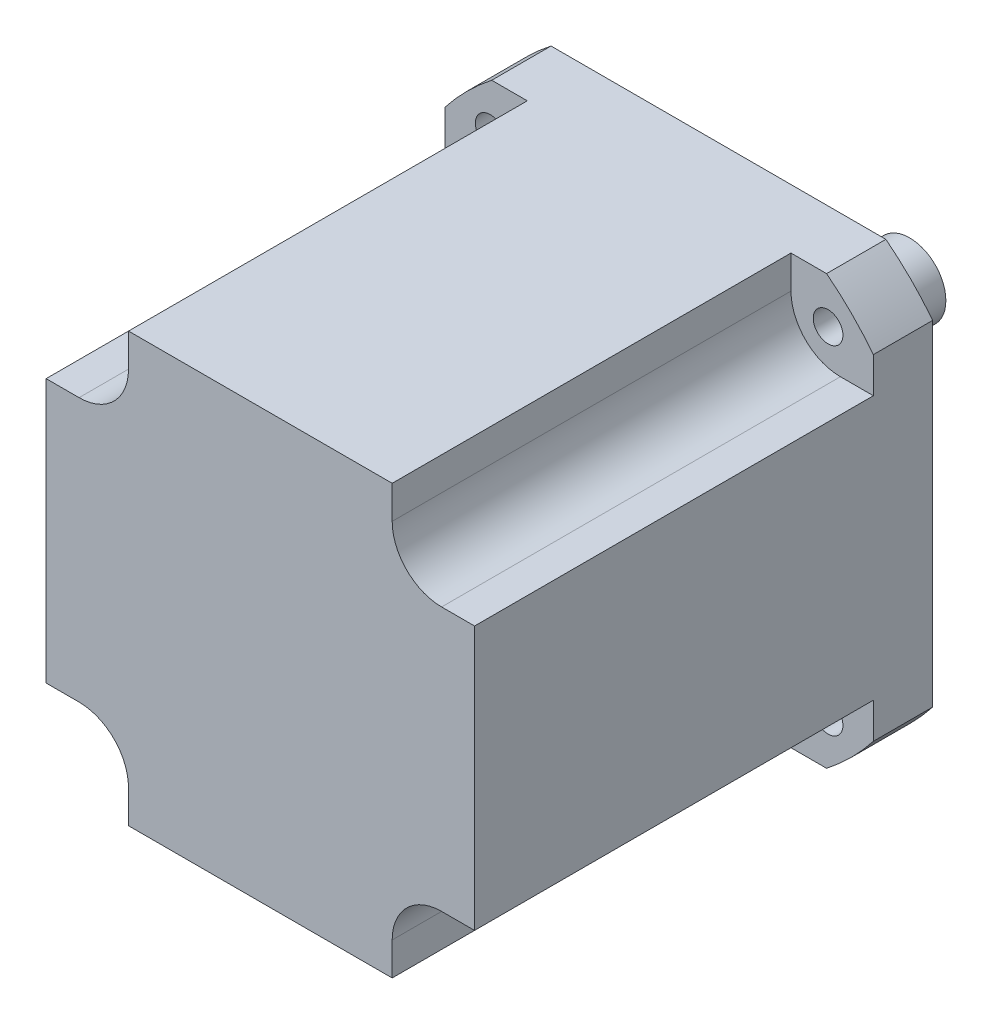
ISO-10303-21;
HEADER;
FILE_DESCRIPTION(('STEP AP214'),'2;1');
FILE_NAME('part.step','',(''),(''),'','','');
FILE_SCHEMA(('AUTOMOTIVE_DESIGN { 1 0 10303 214 1 1 1 1 }'));
ENDSEC;
DATA;
#1=APPLICATION_CONTEXT('core data for automotive mechanical design processes');
#2=APPLICATION_PROTOCOL_DEFINITION('international standard','automotive_design',2000,#1);
#3=PRODUCT_CONTEXT('',#1,'mechanical');
#4=PRODUCT('Part','Part','',(#3));
#5=PRODUCT_RELATED_PRODUCT_CATEGORY('part','',(#4));
#6=PRODUCT_DEFINITION_FORMATION('','',#4);
#7=PRODUCT_DEFINITION_CONTEXT('part definition',#1,'design');
#8=PRODUCT_DEFINITION('design','',#6,#7);
#9=PRODUCT_DEFINITION_SHAPE('','',#8);
#10=(LENGTH_UNIT() NAMED_UNIT(*) SI_UNIT(.MILLI.,.METRE.));
#11=(NAMED_UNIT(*) PLANE_ANGLE_UNIT() SI_UNIT($,.RADIAN.));
#12=(NAMED_UNIT(*) SI_UNIT($,.STERADIAN.) SOLID_ANGLE_UNIT());
#13=UNCERTAINTY_MEASURE_WITH_UNIT(LENGTH_MEASURE(1.E-05),#10,'distance_accuracy_value','');
#14=(GEOMETRIC_REPRESENTATION_CONTEXT(3) GLOBAL_UNCERTAINTY_ASSIGNED_CONTEXT((#13)) GLOBAL_UNIT_ASSIGNED_CONTEXT((#10,
#11,#12)) REPRESENTATION_CONTEXT('',''));
#15=CARTESIAN_POINT('',(0.,0.,0.));
#16=DIRECTION('',(0.,0.,1.));
#17=DIRECTION('',(1.,0.,0.));
#18=AXIS2_PLACEMENT_3D('',#15,#16,#17);
#19=CARTESIAN_POINT('',(0.,-130.000000000001,0.));
#20=DIRECTION('',(0.,0.,1.));
#21=DIRECTION('',(1.,0.,0.));
#22=AXIS2_PLACEMENT_3D('',#19,#20,#21);
#23=PLANE('',#22);
#24=CARTESIAN_POINT('',(116.265241636026,-13.7347583639778,0.));
#25=DIRECTION('',(0.,0.,-1.));
#26=DIRECTION('',(-1.,0.,0.));
#27=AXIS2_PLACEMENT_3D('',#24,#25,#26);
#28=CIRCLE('',#27,4.49999999999839);
#29=CARTESIAN_POINT('',(111.765241636028,-13.7347583639778,0.));
#30=VERTEX_POINT('',#29);
#31=EDGE_CURVE('E234',#30,#30,#28,.T.);
#32=ORIENTED_EDGE('',*,*,#31,.F.);
#33=EDGE_LOOP('',(#32));
#34=FACE_BOUND('',#33,.T.);
#35=CARTESIAN_POINT('',(116.265241636021,-116.265241636029,0.));
#36=DIRECTION('',(0.,0.,-1.));
#37=DIRECTION('',(-1.,0.,0.));
#38=AXIS2_PLACEMENT_3D('',#35,#36,#37);
#39=CIRCLE('',#38,4.5);
#40=CARTESIAN_POINT('',(111.765241636021,-116.265241636029,0.));
#41=VERTEX_POINT('',#40);
#42=EDGE_CURVE('E361',#41,#41,#39,.T.);
#43=ORIENTED_EDGE('',*,*,#42,.F.);
#44=EDGE_LOOP('',(#43));
#45=FACE_BOUND('',#44,.T.);
#46=CARTESIAN_POINT('',(13.7347583639718,-116.265241636026,0.));
#47=DIRECTION('',(0.,0.,-1.));
#48=DIRECTION('',(-1.,0.,0.));
#49=AXIS2_PLACEMENT_3D('',#46,#47,#48);
#50=CIRCLE('',#49,4.5);
#51=CARTESIAN_POINT('',(9.23475836397176,-116.265241636026,0.));
#52=VERTEX_POINT('',#51);
#53=EDGE_CURVE('E364',#52,#52,#50,.T.);
#54=ORIENTED_EDGE('',*,*,#53,.F.);
#55=EDGE_LOOP('',(#54));
#56=FACE_BOUND('',#55,.T.);
#57=CARTESIAN_POINT('',(13.7347583639753,-13.7347583639753,0.));
#58=DIRECTION('',(0.,0.,-1.));
#59=DIRECTION('',(-1.,0.,0.));
#60=AXIS2_PLACEMENT_3D('',#57,#58,#59);
#61=CIRCLE('',#60,4.5);
#62=CARTESIAN_POINT('',(9.23475836397531,-13.7347583639753,0.));
#63=VERTEX_POINT('',#62);
#64=EDGE_CURVE('E367',#63,#63,#61,.T.);
#65=ORIENTED_EDGE('',*,*,#64,.F.);
#66=EDGE_LOOP('',(#65));
#67=FACE_BOUND('',#66,.T.);
#68=CARTESIAN_POINT('',(65.0000000000001,-65.0000000000004,0.));
#69=DIRECTION('',(0.,0.,1.));
#70=DIRECTION('',(1.,0.,0.));
#71=AXIS2_PLACEMENT_3D('',#68,#69,#70);
#72=CIRCLE('',#71,55.);
#73=CARTESIAN_POINT('',(120.,-65.0000000000006,0.));
#74=VERTEX_POINT('',#73);
#75=EDGE_CURVE('E43',#74,#74,#72,.F.);
#76=ORIENTED_EDGE('',*,*,#75,.F.);
#77=EDGE_LOOP('',(#76));
#78=FACE_BOUND('',#77,.T.);
#79=CARTESIAN_POINT('',(65.,-65.0000000000006,0.));
#80=DIRECTION('',(0.,0.,-1.));
#81=DIRECTION('',(0.,1.00000000000001,0.));
#82=AXIS2_PLACEMENT_3D('',#79,#80,#81);
#83=CIRCLE('',#82,82.5);
#84=CARTESIAN_POINT('',(115.806003582254,0.,0.));
#85=VERTEX_POINT('',#84);
#86=CARTESIAN_POINT('',(130.,-14.1939964177467,0.));
#87=VERTEX_POINT('',#86);
#88=EDGE_CURVE('E194',#85,#87,#83,.T.);
#89=ORIENTED_EDGE('',*,*,#88,.T.);
#90=DIRECTION('',(0.,1.00000000000001,0.));
#91=VECTOR('',#90,1.);
#92=CARTESIAN_POINT('',(130.,-8.32667268468867E-13,0.));
#93=LINE('',#92,#91);
#94=CARTESIAN_POINT('',(130.,-115.806003582255,0.));
#95=VERTEX_POINT('',#94);
#96=EDGE_CURVE('E219',#95,#87,#93,.T.);
#97=ORIENTED_EDGE('',*,*,#96,.F.);
#98=CARTESIAN_POINT('',(115.806003582254,-130.000000000001,0.));
#99=VERTEX_POINT('',#98);
#100=EDGE_CURVE('E203',#95,#99,#83,.T.);
#101=ORIENTED_EDGE('',*,*,#100,.T.);
#102=DIRECTION('',(1.,0.,0.));
#103=VECTOR('',#102,1.);
#104=CARTESIAN_POINT('',(0.,-130.000000000001,0.));
#105=LINE('',#104,#103);
#106=CARTESIAN_POINT('',(14.1939964177458,-130.000000000001,0.));
#107=VERTEX_POINT('',#106);
#108=EDGE_CURVE('E224',#107,#99,#105,.T.);
#109=ORIENTED_EDGE('',*,*,#108,.F.);
#110=CARTESIAN_POINT('',(0.,-115.806003582255,0.));
#111=VERTEX_POINT('',#110);
#112=EDGE_CURVE('E396',#107,#111,#83,.T.);
#113=ORIENTED_EDGE('',*,*,#112,.T.);
#114=DIRECTION('',(0.,-1.00000000000001,0.));
#115=VECTOR('',#114,1.);
#116=CARTESIAN_POINT('',(0.,0.,0.));
#117=LINE('',#116,#115);
#118=CARTESIAN_POINT('',(0.,-14.1939964177462,0.));
#119=VERTEX_POINT('',#118);
#120=EDGE_CURVE('E378',#119,#111,#117,.T.);
#121=ORIENTED_EDGE('',*,*,#120,.F.);
#122=CARTESIAN_POINT('',(14.1939964177463,0.,0.));
#123=VERTEX_POINT('',#122);
#124=EDGE_CURVE('E205',#119,#123,#83,.T.);
#125=ORIENTED_EDGE('',*,*,#124,.T.);
#126=DIRECTION('',(-1.,0.,0.));
#127=VECTOR('',#126,1.);
#128=CARTESIAN_POINT('',(0.,0.,0.));
#129=LINE('',#128,#127);
#130=EDGE_CURVE('E211',#85,#123,#129,.T.);
#131=ORIENTED_EDGE('',*,*,#130,.F.);
#132=EDGE_LOOP('',(#89,#97,#101,#109,#113,#121,#125,#131));
#133=FACE_BOUND('',#132,.T.);
#134=ADVANCED_FACE('F35',(#34,#45,#56,#67,#78,#133),#23,.F.);
#135=CARTESIAN_POINT('',(0.,0.,139.));
#136=DIRECTION('',(1.,0.,0.));
#137=DIRECTION('',(0.,1.00000000000001,0.));
#138=AXIS2_PLACEMENT_3D('',#135,#136,#137);
#139=PLANE('',#138);
#140=DIRECTION('',(0.,0.,-1.));
#141=VECTOR('',#140,1.);
#142=CARTESIAN_POINT('',(0.,-115.806003582255,139.));
#143=LINE('',#142,#141);
#144=CARTESIAN_POINT('',(0.,-115.806003582255,18.));
#145=VERTEX_POINT('',#144);
#146=EDGE_CURVE('E401',#145,#111,#143,.T.);
#147=ORIENTED_EDGE('',*,*,#146,.F.);
#148=DIRECTION('',(0.,1.00000000000001,0.));
#149=VECTOR('',#148,1.);
#150=CARTESIAN_POINT('',(0.,-130.000000000001,18.));
#151=LINE('',#150,#149);
#152=CARTESIAN_POINT('',(0.,-105.000000000001,18.));
#153=VERTEX_POINT('',#152);
#154=EDGE_CURVE('E429',#145,#153,#151,.T.);
#155=ORIENTED_EDGE('',*,*,#154,.T.);
#156=DIRECTION('',(0.,0.,-1.));
#157=VECTOR('',#156,1.);
#158=CARTESIAN_POINT('',(0.,-105.000000000001,139.));
#159=LINE('',#158,#157);
#160=CARTESIAN_POINT('',(0.,-105.000000000001,139.));
#161=VERTEX_POINT('',#160);
#162=EDGE_CURVE('E254',#161,#153,#159,.T.);
#163=ORIENTED_EDGE('',*,*,#162,.F.);
#164=DIRECTION('',(0.,-1.00000000000001,0.));
#165=VECTOR('',#164,1.);
#166=CARTESIAN_POINT('',(0.,0.,139.));
#167=LINE('',#166,#165);
#168=CARTESIAN_POINT('',(0.,-25.,139.));
#169=VERTEX_POINT('',#168);
#170=EDGE_CURVE('E218',#169,#161,#167,.T.);
#171=ORIENTED_EDGE('',*,*,#170,.F.);
#172=DIRECTION('',(0.,0.,-1.));
#173=VECTOR('',#172,1.);
#174=CARTESIAN_POINT('',(0.,-25.,139.));
#175=LINE('',#174,#173);
#176=CARTESIAN_POINT('',(0.,-25.,18.));
#177=VERTEX_POINT('',#176);
#178=EDGE_CURVE('E355',#169,#177,#175,.T.);
#179=ORIENTED_EDGE('',*,*,#178,.T.);
#180=DIRECTION('',(0.,1.00000000000001,0.));
#181=VECTOR('',#180,1.);
#182=CARTESIAN_POINT('',(0.,0.,18.));
#183=LINE('',#182,#181);
#184=CARTESIAN_POINT('',(0.,-14.1939964177462,18.));
#185=VERTEX_POINT('',#184);
#186=EDGE_CURVE('E344',#177,#185,#183,.T.);
#187=ORIENTED_EDGE('',*,*,#186,.T.);
#188=DIRECTION('',(0.,0.,-1.));
#189=VECTOR('',#188,1.);
#190=CARTESIAN_POINT('',(0.,-14.1939964177462,139.));
#191=LINE('',#190,#189);
#192=EDGE_CURVE('E50',#119,#185,#191,.F.);
#193=ORIENTED_EDGE('',*,*,#192,.F.);
#194=ORIENTED_EDGE('',*,*,#120,.T.);
#195=EDGE_LOOP('',(#147,#155,#163,#171,#179,#187,#193,#194));
#196=FACE_BOUND('',#195,.T.);
#197=ADVANCED_FACE('F37',(#196),#139,.F.);
#198=CARTESIAN_POINT('',(0.,-130.000000000001,139.));
#199=DIRECTION('',(0.,1.00000000000001,0.));
#200=DIRECTION('',(0.,0.,1.));
#201=AXIS2_PLACEMENT_3D('',#198,#199,#200);
#202=PLANE('',#201);
#203=DIRECTION('',(0.,0.,-1.));
#204=VECTOR('',#203,1.);
#205=CARTESIAN_POINT('',(115.806003582254,-130.000000000001,139.));
#206=LINE('',#205,#204);
#207=CARTESIAN_POINT('',(115.806003582254,-130.000000000001,18.));
#208=VERTEX_POINT('',#207);
#209=EDGE_CURVE('E391',#208,#99,#206,.T.);
#210=ORIENTED_EDGE('',*,*,#209,.F.);
#211=DIRECTION('',(-1.,0.,0.));
#212=VECTOR('',#211,1.);
#213=CARTESIAN_POINT('',(130.,-130.000000000001,18.));
#214=LINE('',#213,#212);
#215=CARTESIAN_POINT('',(105.,-130.000000000001,18.));
#216=VERTEX_POINT('',#215);
#217=EDGE_CURVE('E288',#208,#216,#214,.T.);
#218=ORIENTED_EDGE('',*,*,#217,.T.);
#219=DIRECTION('',(0.,0.,-1.));
#220=VECTOR('',#219,1.);
#221=CARTESIAN_POINT('',(105.,-130.000000000001,139.));
#222=LINE('',#221,#220);
#223=CARTESIAN_POINT('',(105.,-130.000000000001,139.));
#224=VERTEX_POINT('',#223);
#225=EDGE_CURVE('E293',#224,#216,#222,.T.);
#226=ORIENTED_EDGE('',*,*,#225,.F.);
#227=DIRECTION('',(1.,0.,0.));
#228=VECTOR('',#227,1.);
#229=CARTESIAN_POINT('',(0.,-130.000000000001,139.));
#230=LINE('',#229,#228);
#231=CARTESIAN_POINT('',(25.0000000000001,-130.000000000001,139.));
#232=VERTEX_POINT('',#231);
#233=EDGE_CURVE('E222',#232,#224,#230,.T.);
#234=ORIENTED_EDGE('',*,*,#233,.F.);
#235=DIRECTION('',(0.,0.,-1.));
#236=VECTOR('',#235,1.);
#237=CARTESIAN_POINT('',(25.0000000000001,-130.000000000001,139.));
#238=LINE('',#237,#236);
#239=CARTESIAN_POINT('',(25.0000000000001,-130.000000000001,18.));
#240=VERTEX_POINT('',#239);
#241=EDGE_CURVE('E261',#232,#240,#238,.T.);
#242=ORIENTED_EDGE('',*,*,#241,.T.);
#243=DIRECTION('',(-1.,0.,0.));
#244=VECTOR('',#243,1.);
#245=CARTESIAN_POINT('',(0.,-130.000000000001,18.));
#246=LINE('',#245,#244);
#247=CARTESIAN_POINT('',(14.1939964177458,-130.000000000001,18.));
#248=VERTEX_POINT('',#247);
#249=EDGE_CURVE('E428',#240,#248,#246,.T.);
#250=ORIENTED_EDGE('',*,*,#249,.T.);
#251=DIRECTION('',(0.,0.,-1.));
#252=VECTOR('',#251,1.);
#253=CARTESIAN_POINT('',(14.1939964177458,-130.000000000001,139.));
#254=LINE('',#253,#252);
#255=EDGE_CURVE('E202',#107,#248,#254,.F.);
#256=ORIENTED_EDGE('',*,*,#255,.F.);
#257=ORIENTED_EDGE('',*,*,#108,.T.);
#258=EDGE_LOOP('',(#210,#218,#226,#234,#242,#250,#256,#257));
#259=FACE_BOUND('',#258,.T.);
#260=ADVANCED_FACE('F390',(#259),#202,.F.);
#261=CARTESIAN_POINT('',(130.,0.,139.));
#262=DIRECTION('',(-1.,0.,0.));
#263=DIRECTION('',(0.,-1.00000000000001,0.));
#264=AXIS2_PLACEMENT_3D('',#261,#262,#263);
#265=PLANE('',#264);
#266=DIRECTION('',(0.,0.,-1.));
#267=VECTOR('',#266,1.);
#268=CARTESIAN_POINT('',(130.,-14.1939964177467,139.));
#269=LINE('',#268,#267);
#270=CARTESIAN_POINT('',(130.,-14.1939964177467,18.));
#271=VERTEX_POINT('',#270);
#272=EDGE_CURVE('E197',#271,#87,#269,.T.);
#273=ORIENTED_EDGE('',*,*,#272,.F.);
#274=DIRECTION('',(0.,-1.00000000000001,0.));
#275=VECTOR('',#274,1.);
#276=CARTESIAN_POINT('',(130.,-8.32667268468867E-13,18.));
#277=LINE('',#276,#275);
#278=CARTESIAN_POINT('',(130.,-25.0000000000004,18.));
#279=VERTEX_POINT('',#278);
#280=EDGE_CURVE('E317',#271,#279,#277,.T.);
#281=ORIENTED_EDGE('',*,*,#280,.T.);
#282=DIRECTION('',(0.,0.,-1.));
#283=VECTOR('',#282,1.);
#284=CARTESIAN_POINT('',(130.,-25.0000000000004,139.));
#285=LINE('',#284,#283);
#286=CARTESIAN_POINT('',(130.,-25.0000000000004,139.));
#287=VERTEX_POINT('',#286);
#288=EDGE_CURVE('E322',#287,#279,#285,.T.);
#289=ORIENTED_EDGE('',*,*,#288,.F.);
#290=DIRECTION('',(0.,1.00000000000001,0.));
#291=VECTOR('',#290,1.);
#292=CARTESIAN_POINT('',(130.,0.,139.));
#293=LINE('',#292,#291);
#294=CARTESIAN_POINT('',(130.,-105.000000000001,139.));
#295=VERTEX_POINT('',#294);
#296=EDGE_CURVE('E381',#295,#287,#293,.T.);
#297=ORIENTED_EDGE('',*,*,#296,.F.);
#298=DIRECTION('',(0.,0.,-1.));
#299=VECTOR('',#298,1.);
#300=CARTESIAN_POINT('',(130.,-105.000000000001,139.));
#301=LINE('',#300,#299);
#302=CARTESIAN_POINT('',(130.,-105.000000000001,18.));
#303=VERTEX_POINT('',#302);
#304=EDGE_CURVE('E296',#295,#303,#301,.T.);
#305=ORIENTED_EDGE('',*,*,#304,.T.);
#306=DIRECTION('',(0.,-1.00000000000001,0.));
#307=VECTOR('',#306,1.);
#308=CARTESIAN_POINT('',(130.,-130.000000000001,18.));
#309=LINE('',#308,#307);
#310=CARTESIAN_POINT('',(130.,-115.806003582255,18.));
#311=VERTEX_POINT('',#310);
#312=EDGE_CURVE('E285',#303,#311,#309,.T.);
#313=ORIENTED_EDGE('',*,*,#312,.T.);
#314=DIRECTION('',(0.,0.,-1.));
#315=VECTOR('',#314,1.);
#316=CARTESIAN_POINT('',(130.,-115.806003582255,139.));
#317=LINE('',#316,#315);
#318=EDGE_CURVE('E405',#95,#311,#317,.F.);
#319=ORIENTED_EDGE('',*,*,#318,.F.);
#320=ORIENTED_EDGE('',*,*,#96,.T.);
#321=EDGE_LOOP('',(#273,#281,#289,#297,#305,#313,#319,#320));
#322=FACE_BOUND('',#321,.T.);
#323=ADVANCED_FACE('F491',(#322),#265,.F.);
#324=CARTESIAN_POINT('',(0.,0.,139.));
#325=DIRECTION('',(0.,-1.00000000000001,0.));
#326=DIRECTION('',(0.,0.,-1.));
#327=AXIS2_PLACEMENT_3D('',#324,#325,#326);
#328=PLANE('',#327);
#329=DIRECTION('',(0.,0.,-1.));
#330=VECTOR('',#329,1.);
#331=CARTESIAN_POINT('',(14.1939964177462,0.,139.));
#332=LINE('',#331,#330);
#333=CARTESIAN_POINT('',(14.1939964177463,0.,18.));
#334=VERTEX_POINT('',#333);
#335=EDGE_CURVE('E412',#334,#123,#332,.T.);
#336=ORIENTED_EDGE('',*,*,#335,.F.);
#337=DIRECTION('',(1.,0.,0.));
#338=VECTOR('',#337,1.);
#339=CARTESIAN_POINT('',(0.,0.,18.));
#340=LINE('',#339,#338);
#341=CARTESIAN_POINT('',(25.0000000000001,0.,18.));
#342=VERTEX_POINT('',#341);
#343=EDGE_CURVE('E347',#334,#342,#340,.T.);
#344=ORIENTED_EDGE('',*,*,#343,.T.);
#345=DIRECTION('',(0.,0.,-1.));
#346=VECTOR('',#345,1.);
#347=CARTESIAN_POINT('',(25.0000000000001,0.,139.));
#348=LINE('',#347,#346);
#349=CARTESIAN_POINT('',(25.0000000000001,0.,139.));
#350=VERTEX_POINT('',#349);
#351=EDGE_CURVE('E352',#350,#342,#348,.T.);
#352=ORIENTED_EDGE('',*,*,#351,.F.);
#353=DIRECTION('',(-1.,0.,0.));
#354=VECTOR('',#353,1.);
#355=CARTESIAN_POINT('',(0.,0.,139.));
#356=LINE('',#355,#354);
#357=CARTESIAN_POINT('',(105.,0.,139.));
#358=VERTEX_POINT('',#357);
#359=EDGE_CURVE('E230',#358,#350,#356,.T.);
#360=ORIENTED_EDGE('',*,*,#359,.F.);
#361=DIRECTION('',(0.,0.,-1.));
#362=VECTOR('',#361,1.);
#363=CARTESIAN_POINT('',(105.,0.,139.));
#364=LINE('',#363,#362);
#365=CARTESIAN_POINT('',(105.,0.,18.));
#366=VERTEX_POINT('',#365);
#367=EDGE_CURVE('E325',#358,#366,#364,.T.);
#368=ORIENTED_EDGE('',*,*,#367,.T.);
#369=DIRECTION('',(1.,0.,0.));
#370=VECTOR('',#369,1.);
#371=CARTESIAN_POINT('',(130.,-8.32667268468867E-13,18.));
#372=LINE('',#371,#370);
#373=CARTESIAN_POINT('',(115.806003582254,0.,18.));
#374=VERTEX_POINT('',#373);
#375=EDGE_CURVE('E213',#366,#374,#372,.T.);
#376=ORIENTED_EDGE('',*,*,#375,.T.);
#377=DIRECTION('',(0.,0.,-1.));
#378=VECTOR('',#377,1.);
#379=CARTESIAN_POINT('',(115.806003582254,0.,139.));
#380=LINE('',#379,#378);
#381=EDGE_CURVE('E58',#85,#374,#380,.F.);
#382=ORIENTED_EDGE('',*,*,#381,.F.);
#383=ORIENTED_EDGE('',*,*,#130,.T.);
#384=EDGE_LOOP('',(#336,#344,#352,#360,#368,#376,#382,#383));
#385=FACE_BOUND('',#384,.T.);
#386=ADVANCED_FACE('F210',(#385),#328,.F.);
#387=CARTESIAN_POINT('',(10.,-9.99999999999998,18.));
#388=DIRECTION('',(0.,0.,-1.));
#389=DIRECTION('',(-1.,0.,0.));
#390=AXIS2_PLACEMENT_3D('',#387,#388,#389);
#391=PLANE('',#390);
#392=CARTESIAN_POINT('',(13.7347583639753,-13.7347583639753,18.));
#393=DIRECTION('',(0.,0.,-1.));
#394=DIRECTION('',(-1.,0.,0.));
#395=AXIS2_PLACEMENT_3D('',#392,#393,#394);
#396=CIRCLE('',#395,4.5);
#397=CARTESIAN_POINT('',(9.23475836397531,-13.7347583639753,18.));
#398=VERTEX_POINT('',#397);
#399=EDGE_CURVE('E231',#398,#398,#396,.F.);
#400=ORIENTED_EDGE('',*,*,#399,.F.);
#401=EDGE_LOOP('',(#400));
#402=FACE_BOUND('',#401,.T.);
#403=CARTESIAN_POINT('',(65.,-65.0000000000006,18.));
#404=DIRECTION('',(0.,0.,-1.));
#405=DIRECTION('',(-1.,0.,0.));
#406=AXIS2_PLACEMENT_3D('',#403,#404,#405);
#407=CIRCLE('',#406,82.5);
#408=EDGE_CURVE('E410',#185,#334,#407,.T.);
#409=ORIENTED_EDGE('',*,*,#408,.F.);
#410=ORIENTED_EDGE('',*,*,#186,.F.);
#411=DIRECTION('',(-1.,0.,0.));
#412=VECTOR('',#411,1.);
#413=CARTESIAN_POINT('',(0.,-25.,18.));
#414=LINE('',#413,#412);
#415=CARTESIAN_POINT('',(10.,-25.,18.));
#416=VERTEX_POINT('',#415);
#417=EDGE_CURVE('E341',#416,#177,#414,.T.);
#418=ORIENTED_EDGE('',*,*,#417,.F.);
#419=CARTESIAN_POINT('',(10.,-9.99999999999998,18.));
#420=DIRECTION('',(0.,0.,-1.));
#421=DIRECTION('',(-1.,0.,0.));
#422=AXIS2_PLACEMENT_3D('',#419,#420,#421);
#423=CIRCLE('',#422,15.);
#424=CARTESIAN_POINT('',(25.0000000000001,-9.99999999999998,18.));
#425=VERTEX_POINT('',#424);
#426=EDGE_CURVE('E239',#425,#416,#423,.T.);
#427=ORIENTED_EDGE('',*,*,#426,.F.);
#428=DIRECTION('',(0.,-1.00000000000001,0.));
#429=VECTOR('',#428,1.);
#430=CARTESIAN_POINT('',(25.0000000000001,0.,18.));
#431=LINE('',#430,#429);
#432=EDGE_CURVE('E332',#342,#425,#431,.T.);
#433=ORIENTED_EDGE('',*,*,#432,.F.);
#434=ORIENTED_EDGE('',*,*,#343,.F.);
#435=EDGE_LOOP('',(#409,#410,#418,#427,#433,#434));
#436=FACE_BOUND('',#435,.T.);
#437=ADVANCED_FACE('F459',(#402,#436),#391,.F.);
#438=CARTESIAN_POINT('',(120.,-10.0000000000004,18.));
#439=DIRECTION('',(0.,0.,1.));
#440=DIRECTION('',(1.,0.,0.));
#441=AXIS2_PLACEMENT_3D('',#438,#439,#440);
#442=PLANE('',#441);
#443=CARTESIAN_POINT('',(116.265241636026,-13.7347583639778,18.));
#444=DIRECTION('',(0.,0.,1.));
#445=DIRECTION('',(1.,0.,0.));
#446=AXIS2_PLACEMENT_3D('',#443,#444,#445);
#447=CIRCLE('',#446,4.49999999999839);
#448=CARTESIAN_POINT('',(120.765241636024,-13.7347583639778,18.));
#449=VERTEX_POINT('',#448);
#450=EDGE_CURVE('E236',#449,#449,#447,.F.);
#451=ORIENTED_EDGE('',*,*,#450,.T.);
#452=EDGE_LOOP('',(#451));
#453=FACE_BOUND('',#452,.T.);
#454=ORIENTED_EDGE('',*,*,#280,.F.);
#455=CARTESIAN_POINT('',(65.,-65.0000000000006,18.));
#456=DIRECTION('',(0.,0.,1.));
#457=DIRECTION('',(1.,0.,0.));
#458=AXIS2_PLACEMENT_3D('',#455,#456,#457);
#459=CIRCLE('',#458,82.5);
#460=EDGE_CURVE('E214',#271,#374,#459,.T.);
#461=ORIENTED_EDGE('',*,*,#460,.T.);
#462=ORIENTED_EDGE('',*,*,#375,.F.);
#463=DIRECTION('',(0.,1.00000000000001,0.));
#464=VECTOR('',#463,1.);
#465=CARTESIAN_POINT('',(105.,0.,18.));
#466=LINE('',#465,#464);
#467=CARTESIAN_POINT('',(105.,-10.0000000000004,18.));
#468=VERTEX_POINT('',#467);
#469=EDGE_CURVE('E313',#468,#366,#466,.T.);
#470=ORIENTED_EDGE('',*,*,#469,.F.);
#471=CARTESIAN_POINT('',(120.,-10.0000000000004,18.));
#472=DIRECTION('',(0.,0.,-1.));
#473=DIRECTION('',(1.,0.,0.));
#474=AXIS2_PLACEMENT_3D('',#471,#472,#473);
#475=CIRCLE('',#474,15.);
#476=CARTESIAN_POINT('',(120.,-25.0000000000004,18.));
#477=VERTEX_POINT('',#476);
#478=EDGE_CURVE('E243',#477,#468,#475,.T.);
#479=ORIENTED_EDGE('',*,*,#478,.F.);
#480=DIRECTION('',(-1.,0.,0.));
#481=VECTOR('',#480,1.);
#482=CARTESIAN_POINT('',(130.,-25.0000000000004,18.));
#483=LINE('',#482,#481);
#484=EDGE_CURVE('E304',#279,#477,#483,.T.);
#485=ORIENTED_EDGE('',*,*,#484,.F.);
#486=EDGE_LOOP('',(#454,#461,#462,#470,#479,#485));
#487=FACE_BOUND('',#486,.T.);
#488=ADVANCED_FACE('F513',(#453,#487),#442,.T.);
#489=CARTESIAN_POINT('',(120.,-120.000000000001,18.));
#490=DIRECTION('',(0.,0.,-1.));
#491=DIRECTION('',(-1.,0.,0.));
#492=AXIS2_PLACEMENT_3D('',#489,#490,#491);
#493=PLANE('',#492);
#494=CARTESIAN_POINT('',(116.265241636021,-116.265241636029,18.));
#495=DIRECTION('',(0.,0.,-1.));
#496=DIRECTION('',(-1.,0.,0.));
#497=AXIS2_PLACEMENT_3D('',#494,#495,#496);
#498=CIRCLE('',#497,4.5);
#499=CARTESIAN_POINT('',(111.765241636021,-116.265241636029,18.));
#500=VERTEX_POINT('',#499);
#501=EDGE_CURVE('E241',#500,#500,#498,.F.);
#502=ORIENTED_EDGE('',*,*,#501,.F.);
#503=EDGE_LOOP('',(#502));
#504=FACE_BOUND('',#503,.T.);
#505=CARTESIAN_POINT('',(65.,-65.0000000000006,18.));
#506=DIRECTION('',(0.,0.,-1.));
#507=DIRECTION('',(-1.,0.,0.));
#508=AXIS2_PLACEMENT_3D('',#505,#506,#507);
#509=CIRCLE('',#508,82.5);
#510=EDGE_CURVE('E403',#311,#208,#509,.T.);
#511=ORIENTED_EDGE('',*,*,#510,.F.);
#512=ORIENTED_EDGE('',*,*,#312,.F.);
#513=DIRECTION('',(1.,0.,0.));
#514=VECTOR('',#513,1.);
#515=CARTESIAN_POINT('',(130.,-105.000000000001,18.));
#516=LINE('',#515,#514);
#517=CARTESIAN_POINT('',(120.,-105.000000000001,18.));
#518=VERTEX_POINT('',#517);
#519=EDGE_CURVE('E252',#518,#303,#516,.T.);
#520=ORIENTED_EDGE('',*,*,#519,.F.);
#521=CARTESIAN_POINT('',(120.,-120.000000000001,18.));
#522=DIRECTION('',(0.,0.,-1.));
#523=DIRECTION('',(-1.,0.,0.));
#524=AXIS2_PLACEMENT_3D('',#521,#522,#523);
#525=CIRCLE('',#524,15.);
#526=CARTESIAN_POINT('',(105.,-120.000000000001,18.));
#527=VERTEX_POINT('',#526);
#528=EDGE_CURVE('E247',#527,#518,#525,.T.);
#529=ORIENTED_EDGE('',*,*,#528,.F.);
#530=DIRECTION('',(0.,1.00000000000001,0.));
#531=VECTOR('',#530,1.);
#532=CARTESIAN_POINT('',(105.,-130.000000000001,18.));
#533=LINE('',#532,#531);
#534=EDGE_CURVE('E276',#216,#527,#533,.T.);
#535=ORIENTED_EDGE('',*,*,#534,.F.);
#536=ORIENTED_EDGE('',*,*,#217,.F.);
#537=EDGE_LOOP('',(#511,#512,#520,#529,#535,#536));
#538=FACE_BOUND('',#537,.T.);
#539=ADVANCED_FACE('F520',(#504,#538),#493,.F.);
#540=CARTESIAN_POINT('',(10.,-120.000000000001,18.));
#541=DIRECTION('',(0.,0.,1.));
#542=DIRECTION('',(1.,0.,0.));
#543=AXIS2_PLACEMENT_3D('',#540,#541,#542);
#544=PLANE('',#543);
#545=CARTESIAN_POINT('',(13.7347583639718,-116.265241636026,18.));
#546=DIRECTION('',(0.,0.,1.));
#547=DIRECTION('',(1.,0.,0.));
#548=AXIS2_PLACEMENT_3D('',#545,#546,#547);
#549=CIRCLE('',#548,4.5);
#550=CARTESIAN_POINT('',(18.2347583639718,-116.265241636026,18.));
#551=VERTEX_POINT('',#550);
#552=EDGE_CURVE('E245',#551,#551,#549,.F.);
#553=ORIENTED_EDGE('',*,*,#552,.T.);
#554=EDGE_LOOP('',(#553));
#555=FACE_BOUND('',#554,.T.);
#556=ORIENTED_EDGE('',*,*,#154,.F.);
#557=CARTESIAN_POINT('',(65.,-65.0000000000006,18.));
#558=DIRECTION('',(0.,0.,1.));
#559=DIRECTION('',(1.,0.,0.));
#560=AXIS2_PLACEMENT_3D('',#557,#558,#559);
#561=CIRCLE('',#560,82.5);
#562=EDGE_CURVE('E12',#145,#248,#561,.T.);
#563=ORIENTED_EDGE('',*,*,#562,.T.);
#564=ORIENTED_EDGE('',*,*,#249,.F.);
#565=DIRECTION('',(0.,-1.00000000000001,0.));
#566=VECTOR('',#565,1.);
#567=CARTESIAN_POINT('',(25.0000000000001,-130.000000000001,18.));
#568=LINE('',#567,#566);
#569=CARTESIAN_POINT('',(25.0000000000001,-120.000000000001,18.));
#570=VERTEX_POINT('',#569);
#571=EDGE_CURVE('E425',#570,#240,#568,.T.);
#572=ORIENTED_EDGE('',*,*,#571,.F.);
#573=CARTESIAN_POINT('',(10.,-120.000000000001,18.));
#574=DIRECTION('',(0.,0.,-1.));
#575=DIRECTION('',(1.,0.,0.));
#576=AXIS2_PLACEMENT_3D('',#573,#574,#575);
#577=CIRCLE('',#576,15.);
#578=CARTESIAN_POINT('',(10.,-105.000000000001,18.));
#579=VERTEX_POINT('',#578);
#580=EDGE_CURVE('E415',#579,#570,#577,.T.);
#581=ORIENTED_EDGE('',*,*,#580,.F.);
#582=DIRECTION('',(1.,0.,0.));
#583=VECTOR('',#582,1.);
#584=CARTESIAN_POINT('',(0.,-105.000000000001,18.));
#585=LINE('',#584,#583);
#586=EDGE_CURVE('E264',#153,#579,#585,.T.);
#587=ORIENTED_EDGE('',*,*,#586,.F.);
#588=EDGE_LOOP('',(#556,#563,#564,#572,#581,#587));
#589=FACE_BOUND('',#588,.T.);
#590=ADVANCED_FACE('F439',(#555,#589),#544,.T.);
#591=CARTESIAN_POINT('',(13.7347583639718,-116.265241636026,137.));
#592=DIRECTION('',(0.,0.,-1.));
#593=DIRECTION('',(-1.,0.,0.));
#594=AXIS2_PLACEMENT_3D('',#591,#592,#593);
#595=CYLINDRICAL_SURFACE('',#594,4.5);
#596=ORIENTED_EDGE('',*,*,#53,.T.);
#597=EDGE_LOOP('',(#596));
#598=FACE_BOUND('',#597,.T.);
#599=ORIENTED_EDGE('',*,*,#552,.F.);
#600=EDGE_LOOP('',(#599));
#601=FACE_BOUND('',#600,.T.);
#602=ADVANCED_FACE('F535',(#598,#601),#595,.F.);
#603=CARTESIAN_POINT('',(116.265241636026,-13.7347583639778,137.));
#604=DIRECTION('',(0.,0.,-1.));
#605=DIRECTION('',(-1.,0.,0.));
#606=AXIS2_PLACEMENT_3D('',#603,#604,#605);
#607=CYLINDRICAL_SURFACE('',#606,4.49999999999839);
#608=ORIENTED_EDGE('',*,*,#31,.T.);
#609=EDGE_LOOP('',(#608));
#610=FACE_BOUND('',#609,.T.);
#611=ORIENTED_EDGE('',*,*,#450,.F.);
#612=EDGE_LOOP('',(#611));
#613=FACE_BOUND('',#612,.T.);
#614=ADVANCED_FACE('F542',(#610,#613),#607,.F.);
#615=CARTESIAN_POINT('',(65.0000000000001,-65.0000000000004,-6.00000000000001));
#616=DIRECTION('',(0.,0.,-1.));
#617=DIRECTION('',(-1.,0.,0.));
#618=AXIS2_PLACEMENT_3D('',#615,#616,#617);
#619=PLANE('',#618);
#620=CARTESIAN_POINT('',(65.0000000000001,-65.0000000000004,-6.00000000000001));
#621=DIRECTION('',(0.,0.,-1.));
#622=DIRECTION('',(-1.,0.,0.));
#623=AXIS2_PLACEMENT_3D('',#620,#621,#622);
#624=CIRCLE('',#623,55.);
#625=CARTESIAN_POINT('',(10.0000000000001,-65.0000000000002,-5.99999999999997));
#626=VERTEX_POINT('',#625);
#627=EDGE_CURVE('E374',#626,#626,#624,.T.);
#628=ORIENTED_EDGE('',*,*,#627,.T.);
#629=EDGE_LOOP('',(#628));
#630=FACE_BOUND('',#629,.T.);
#631=CARTESIAN_POINT('',(65.0000000000001,-65.0000000000004,-6.00000000000001));
#632=DIRECTION('',(0.,0.,-1.));
#633=DIRECTION('',(-1.,0.,0.));
#634=AXIS2_PLACEMENT_3D('',#631,#632,#633);
#635=CIRCLE('',#634,11.);
#636=CARTESIAN_POINT('',(76.,-65.0000000000004,-5.99999999999999));
#637=VERTEX_POINT('',#636);
#638=EDGE_CURVE('E370',#637,#637,#635,.T.);
#639=ORIENTED_EDGE('',*,*,#638,.F.);
#640=EDGE_LOOP('',(#639));
#641=FACE_BOUND('',#640,.T.);
#642=ADVANCED_FACE('F550',(#630,#641),#619,.T.);
#643=CARTESIAN_POINT('',(0.,-130.000000000001,139.));
#644=DIRECTION('',(0.,0.,1.));
#645=DIRECTION('',(1.,0.,0.));
#646=AXIS2_PLACEMENT_3D('',#643,#644,#645);
#647=PLANE('',#646);
#648=DIRECTION('',(1.,0.,0.));
#649=VECTOR('',#648,1.);
#650=CARTESIAN_POINT('',(0.,-105.000000000001,139.));
#651=LINE('',#650,#649);
#652=CARTESIAN_POINT('',(10.,-105.000000000001,139.));
#653=VERTEX_POINT('',#652);
#654=EDGE_CURVE('E271',#161,#653,#651,.T.);
#655=ORIENTED_EDGE('',*,*,#654,.T.);
#656=CARTESIAN_POINT('',(10.,-120.000000000001,139.));
#657=DIRECTION('',(0.,0.,-1.));
#658=DIRECTION('',(1.,0.,0.));
#659=AXIS2_PLACEMENT_3D('',#656,#657,#658);
#660=CIRCLE('',#659,15.);
#661=CARTESIAN_POINT('',(25.0000000000001,-120.000000000001,139.));
#662=VERTEX_POINT('',#661);
#663=EDGE_CURVE('E416',#653,#662,#660,.T.);
#664=ORIENTED_EDGE('',*,*,#663,.T.);
#665=DIRECTION('',(0.,-1.00000000000001,0.));
#666=VECTOR('',#665,1.);
#667=CARTESIAN_POINT('',(25.0000000000001,-130.000000000001,139.));
#668=LINE('',#667,#666);
#669=EDGE_CURVE('E419',#662,#232,#668,.T.);
#670=ORIENTED_EDGE('',*,*,#669,.T.);
#671=ORIENTED_EDGE('',*,*,#233,.T.);
#672=DIRECTION('',(0.,1.00000000000001,0.));
#673=VECTOR('',#672,1.);
#674=CARTESIAN_POINT('',(105.,-130.000000000001,139.));
#675=LINE('',#674,#673);
#676=CARTESIAN_POINT('',(105.,-120.000000000001,139.));
#677=VERTEX_POINT('',#676);
#678=EDGE_CURVE('E279',#224,#677,#675,.T.);
#679=ORIENTED_EDGE('',*,*,#678,.T.);
#680=CARTESIAN_POINT('',(120.,-120.000000000001,139.));
#681=DIRECTION('',(0.,0.,-1.));
#682=DIRECTION('',(-1.,0.,0.));
#683=AXIS2_PLACEMENT_3D('',#680,#681,#682);
#684=CIRCLE('',#683,15.);
#685=CARTESIAN_POINT('',(120.,-105.000000000001,139.));
#686=VERTEX_POINT('',#685);
#687=EDGE_CURVE('E272',#677,#686,#684,.T.);
#688=ORIENTED_EDGE('',*,*,#687,.T.);
#689=DIRECTION('',(1.,0.,0.));
#690=VECTOR('',#689,1.);
#691=CARTESIAN_POINT('',(130.,-105.000000000001,139.));
#692=LINE('',#691,#690);
#693=EDGE_CURVE('E275',#686,#295,#692,.T.);
#694=ORIENTED_EDGE('',*,*,#693,.T.);
#695=ORIENTED_EDGE('',*,*,#296,.T.);
#696=DIRECTION('',(-1.,0.,0.));
#697=VECTOR('',#696,1.);
#698=CARTESIAN_POINT('',(130.,-25.0000000000004,139.));
#699=LINE('',#698,#697);
#700=CARTESIAN_POINT('',(120.,-25.0000000000004,139.));
#701=VERTEX_POINT('',#700);
#702=EDGE_CURVE('E307',#287,#701,#699,.T.);
#703=ORIENTED_EDGE('',*,*,#702,.T.);
#704=CARTESIAN_POINT('',(120.,-10.0000000000004,139.));
#705=DIRECTION('',(0.,0.,-1.));
#706=DIRECTION('',(1.,0.,0.));
#707=AXIS2_PLACEMENT_3D('',#704,#705,#706);
#708=CIRCLE('',#707,15.);
#709=CARTESIAN_POINT('',(105.,-10.0000000000004,139.));
#710=VERTEX_POINT('',#709);
#711=EDGE_CURVE('E300',#701,#710,#708,.T.);
#712=ORIENTED_EDGE('',*,*,#711,.T.);
#713=DIRECTION('',(0.,1.00000000000001,0.));
#714=VECTOR('',#713,1.);
#715=CARTESIAN_POINT('',(105.,0.,139.));
#716=LINE('',#715,#714);
#717=EDGE_CURVE('E303',#710,#358,#716,.T.);
#718=ORIENTED_EDGE('',*,*,#717,.T.);
#719=ORIENTED_EDGE('',*,*,#359,.T.);
#720=DIRECTION('',(0.,-1.00000000000001,0.));
#721=VECTOR('',#720,1.);
#722=CARTESIAN_POINT('',(25.0000000000001,0.,139.));
#723=LINE('',#722,#721);
#724=CARTESIAN_POINT('',(25.0000000000001,-9.99999999999998,139.));
#725=VERTEX_POINT('',#724);
#726=EDGE_CURVE('E335',#350,#725,#723,.T.);
#727=ORIENTED_EDGE('',*,*,#726,.T.);
#728=CARTESIAN_POINT('',(10.,-9.99999999999998,139.));
#729=DIRECTION('',(0.,0.,-1.));
#730=DIRECTION('',(-1.,0.,0.));
#731=AXIS2_PLACEMENT_3D('',#728,#729,#730);
#732=CIRCLE('',#731,15.);
#733=CARTESIAN_POINT('',(10.,-25.,139.));
#734=VERTEX_POINT('',#733);
#735=EDGE_CURVE('E328',#725,#734,#732,.T.);
#736=ORIENTED_EDGE('',*,*,#735,.T.);
#737=DIRECTION('',(-1.,0.,0.));
#738=VECTOR('',#737,1.);
#739=CARTESIAN_POINT('',(0.,-25.,139.));
#740=LINE('',#739,#738);
#741=EDGE_CURVE('E331',#734,#169,#740,.T.);
#742=ORIENTED_EDGE('',*,*,#741,.T.);
#743=ORIENTED_EDGE('',*,*,#170,.T.);
#744=EDGE_LOOP('',(#655,#664,#670,#671,#679,#688,#694,#695,#703,#712,#718,#719,#727,#736,#742,#743));
#745=FACE_BOUND('',#744,.T.);
#746=ADVANCED_FACE('F447',(#745),#647,.T.);
#747=CARTESIAN_POINT('',(65.0000000000001,-65.0000000000004,-6.00000000000001));
#748=DIRECTION('',(0.,0.,1.));
#749=DIRECTION('',(1.,0.,0.));
#750=AXIS2_PLACEMENT_3D('',#747,#748,#749);
#751=CYLINDRICAL_SURFACE('',#750,55.);
#752=ORIENTED_EDGE('',*,*,#627,.F.);
#753=EDGE_LOOP('',(#752));
#754=FACE_BOUND('',#753,.T.);
#755=ORIENTED_EDGE('',*,*,#75,.T.);
#756=EDGE_LOOP('',(#755));
#757=FACE_BOUND('',#756,.T.);
#758=ADVANCED_FACE('F565',(#754,#757),#751,.T.);
#759=CARTESIAN_POINT('',(65.0000000000001,-65.0000000000004,-57.9999999999998));
#760=DIRECTION('',(0.,0.,1.));
#761=DIRECTION('',(1.,0.,0.));
#762=AXIS2_PLACEMENT_3D('',#759,#760,#761);
#763=CYLINDRICAL_SURFACE('',#762,11.);
#764=CARTESIAN_POINT('',(65.0000000000001,-65.0000000000004,-57.9999999999998));
#765=DIRECTION('',(0.,0.,-1.));
#766=DIRECTION('',(-1.,0.,0.));
#767=AXIS2_PLACEMENT_3D('',#764,#765,#766);
#768=CIRCLE('',#767,11.);
#769=CARTESIAN_POINT('',(76.0000000000001,-65.0000000000005,-57.9999999999998));
#770=VERTEX_POINT('',#769);
#771=EDGE_CURVE('E371',#770,#770,#768,.T.);
#772=CARTESIAN_POINT('',(76.0000000000001,-65.0000000000005,-57.9999999999998));
#773=CARTESIAN_POINT('',(76.0000000000001,-65.0000000000005,-57.4583333333331));
#774=CARTESIAN_POINT('',(76.0000000000001,-65.0000000000005,-56.9166666666665));
#775=CARTESIAN_POINT('',(76.0000000000001,-65.0000000000005,-55.8333333333331));
#776=CARTESIAN_POINT('',(76.0000000000001,-65.0000000000005,-55.2916666666665));
#777=CARTESIAN_POINT('',(76.0000000000001,-65.0000000000005,-54.2083333333331));
#778=CARTESIAN_POINT('',(76.0000000000001,-65.0000000000005,-53.6666666666665));
#779=CARTESIAN_POINT('',(76.0000000000001,-65.0000000000005,-52.5833333333331));
#780=CARTESIAN_POINT('',(76.0000000000001,-65.0000000000005,-52.0416666666665));
#781=CARTESIAN_POINT('',(76.0000000000001,-65.0000000000005,-50.9583333333331));
#782=CARTESIAN_POINT('',(76.0000000000001,-65.0000000000005,-50.4166666666665));
#783=CARTESIAN_POINT('',(76.0000000000001,-65.0000000000005,-49.3333333333331));
#784=CARTESIAN_POINT('',(76.0000000000001,-65.0000000000004,-48.7916666666665));
#785=CARTESIAN_POINT('',(76.0000000000001,-65.0000000000004,-47.7083333333332));
#786=CARTESIAN_POINT('',(76.,-65.0000000000004,-47.1666666666665));
#787=CARTESIAN_POINT('',(76.,-65.0000000000004,-46.0833333333332));
#788=CARTESIAN_POINT('',(76.,-65.0000000000004,-45.5416666666665));
#789=CARTESIAN_POINT('',(76.,-65.0000000000004,-44.4583333333332));
#790=CARTESIAN_POINT('',(76.,-65.0000000000004,-43.9166666666665));
#791=CARTESIAN_POINT('',(76.,-65.0000000000004,-42.8333333333332));
#792=CARTESIAN_POINT('',(76.,-65.0000000000004,-42.2916666666665));
#793=CARTESIAN_POINT('',(76.,-65.0000000000004,-41.2083333333332));
#794=CARTESIAN_POINT('',(76.,-65.0000000000004,-40.6666666666665));
#795=CARTESIAN_POINT('',(76.,-65.0000000000004,-39.5833333333332));
#796=CARTESIAN_POINT('',(76.,-65.0000000000004,-39.0416666666665));
#797=CARTESIAN_POINT('',(76.,-65.0000000000004,-37.9583333333332));
#798=CARTESIAN_POINT('',(76.,-65.0000000000004,-37.4166666666665));
#799=CARTESIAN_POINT('',(76.,-65.0000000000004,-36.3333333333332));
#800=CARTESIAN_POINT('',(76.,-65.0000000000004,-35.7916666666665));
#801=CARTESIAN_POINT('',(76.,-65.0000000000004,-34.7083333333332));
#802=CARTESIAN_POINT('',(76.,-65.0000000000004,-34.1666666666665));
#803=CARTESIAN_POINT('',(76.,-65.0000000000004,-33.0833333333332));
#804=CARTESIAN_POINT('',(76.,-65.0000000000004,-32.5416666666666));
#805=CARTESIAN_POINT('',(76.,-65.0000000000004,-31.4583333333332));
#806=CARTESIAN_POINT('',(76.,-65.0000000000004,-30.9166666666666));
#807=CARTESIAN_POINT('',(76.,-65.0000000000004,-29.8333333333332));
#808=CARTESIAN_POINT('',(76.,-65.0000000000004,-29.2916666666666));
#809=CARTESIAN_POINT('',(76.,-65.0000000000004,-28.2083333333332));
#810=CARTESIAN_POINT('',(76.,-65.0000000000004,-27.6666666666666));
#811=CARTESIAN_POINT('',(76.,-65.0000000000004,-26.5833333333332));
#812=CARTESIAN_POINT('',(76.,-65.0000000000004,-26.0416666666666));
#813=CARTESIAN_POINT('',(76.,-65.0000000000004,-24.9583333333332));
#814=CARTESIAN_POINT('',(76.,-65.0000000000004,-24.4166666666666));
#815=CARTESIAN_POINT('',(76.,-65.0000000000004,-23.3333333333333));
#816=CARTESIAN_POINT('',(76.,-65.0000000000004,-22.7916666666666));
#817=CARTESIAN_POINT('',(76.,-65.0000000000004,-21.7083333333333));
#818=CARTESIAN_POINT('',(76.,-65.0000000000004,-21.1666666666666));
#819=CARTESIAN_POINT('',(76.,-65.0000000000004,-20.0833333333333));
#820=CARTESIAN_POINT('',(76.,-65.0000000000004,-19.5416666666666));
#821=CARTESIAN_POINT('',(76.,-65.0000000000004,-18.4583333333333));
#822=CARTESIAN_POINT('',(76.,-65.0000000000004,-17.9166666666666));
#823=CARTESIAN_POINT('',(76.,-65.0000000000004,-16.8333333333333));
#824=CARTESIAN_POINT('',(76.,-65.0000000000004,-16.2916666666666));
#825=CARTESIAN_POINT('',(76.,-65.0000000000004,-15.2083333333333));
#826=CARTESIAN_POINT('',(76.,-65.0000000000004,-14.6666666666666));
#827=CARTESIAN_POINT('',(76.,-65.0000000000004,-13.5833333333333));
#828=CARTESIAN_POINT('',(76.,-65.0000000000004,-13.0416666666666));
#829=CARTESIAN_POINT('',(76.,-65.0000000000004,-11.9583333333333));
#830=CARTESIAN_POINT('',(76.,-65.0000000000004,-11.4166666666666));
#831=CARTESIAN_POINT('',(76.,-65.0000000000004,-10.3333333333333));
#832=CARTESIAN_POINT('',(76.,-65.0000000000004,-9.79166666666664));
#833=CARTESIAN_POINT('',(76.,-65.0000000000004,-8.70833333333332));
#834=CARTESIAN_POINT('',(76.,-65.0000000000004,-8.16666666666665));
#835=CARTESIAN_POINT('',(76.,-65.0000000000004,-7.08333333333332));
#836=CARTESIAN_POINT('',(76.,-65.0000000000004,-6.54166666666666));
#837=CARTESIAN_POINT('',(76.,-65.0000000000004,-5.99999999999999));
#838=B_SPLINE_CURVE_WITH_KNOTS('',3,(#772,#773,#774,#775,#776,#777,#778,#779,#780,#781,#782,
#783,#784,#785,#786,#787,#788,#789,#790,#791,#792,#793,#794,#795,#796,#797,#798,#799,#800,#801,
#802,#803,#804,#805,#806,#807,#808,#809,#810,#811,#812,#813,#814,#815,#816,#817,#818,#819,#820,
#821,#822,#823,#824,#825,#826,#827,#828,#829,#830,#831,#832,#833,#834,#835,#836,#837),
.UNSPECIFIED.,.F.,.F.,(4,2,2,2,2,2,2,2,2,2,2,2,2,2,2,2,2,2,2,2,2,2,2,2,2,2,2,2,2,2,2,2,4),(0.,
1.62499999999999,3.24999999999998,4.87499999999998,6.49999999999997,8.12499999999997,
9.74999999999995,11.3749999999999,12.9999999999999,14.6249999999999,16.2499999999999,
17.8749999999999,19.4999999999999,21.1249999999999,22.7499999999999,24.3749999999999,
25.9999999999999,27.6249999999999,29.2499999999999,30.8749999999999,32.4999999999999,
34.1249999999999,35.7499999999999,37.3749999999998,38.9999999999998,40.6249999999998,
42.2499999999998,43.8749999999998,45.4999999999998,47.1249999999998,48.7499999999998,
50.3749999999998,51.9999999999998),.UNSPECIFIED.);
#839=EDGE_CURVE('BSEAM571',#770,#637,#838,.T.);
#840=ORIENTED_EDGE('',*,*,#771,.F.);
#841=ORIENTED_EDGE('',*,*,#638,.T.);
#842=ORIENTED_EDGE('',*,*,#839,.T.);
#843=ORIENTED_EDGE('',*,*,#839,.F.);
#844=EDGE_LOOP('',(#840,#842,#841,#843));
#845=FACE_BOUND('',#844,.T.);
#846=ADVANCED_FACE('F571',(#845),#763,.T.);
#847=CARTESIAN_POINT('',(65.0000000000001,-65.0000000000004,-57.9999999999998));
#848=DIRECTION('',(0.,0.,-1.));
#849=DIRECTION('',(-1.,0.,0.));
#850=AXIS2_PLACEMENT_3D('',#847,#848,#849);
#851=PLANE('',#850);
#852=ORIENTED_EDGE('',*,*,#771,.T.);
#853=EDGE_LOOP('',(#852));
#854=FACE_BOUND('',#853,.T.);
#855=ADVANCED_FACE('F578',(#854),#851,.T.);
#856=CARTESIAN_POINT('',(13.7347583639753,-13.7347583639753,137.));
#857=DIRECTION('',(0.,0.,-1.));
#858=DIRECTION('',(-1.,0.,0.));
#859=AXIS2_PLACEMENT_3D('',#856,#857,#858);
#860=CYLINDRICAL_SURFACE('',#859,4.5);
#861=ORIENTED_EDGE('',*,*,#399,.T.);
#862=EDGE_LOOP('',(#861));
#863=FACE_BOUND('',#862,.T.);
#864=ORIENTED_EDGE('',*,*,#64,.T.);
#865=EDGE_LOOP('',(#864));
#866=FACE_BOUND('',#865,.T.);
#867=ADVANCED_FACE('F586',(#863,#866),#860,.F.);
#868=CARTESIAN_POINT('',(116.265241636021,-116.265241636029,137.));
#869=DIRECTION('',(0.,0.,-1.));
#870=DIRECTION('',(-1.,0.,0.));
#871=AXIS2_PLACEMENT_3D('',#868,#869,#870);
#872=CYLINDRICAL_SURFACE('',#871,4.5);
#873=ORIENTED_EDGE('',*,*,#501,.T.);
#874=EDGE_LOOP('',(#873));
#875=FACE_BOUND('',#874,.T.);
#876=ORIENTED_EDGE('',*,*,#42,.T.);
#877=EDGE_LOOP('',(#876));
#878=FACE_BOUND('',#877,.T.);
#879=ADVANCED_FACE('F475',(#875,#878),#872,.F.);
#880=CARTESIAN_POINT('',(10.,-9.99999999999998,139.));
#881=DIRECTION('',(0.,0.,-1.));
#882=DIRECTION('',(-1.,0.,0.));
#883=AXIS2_PLACEMENT_3D('',#880,#881,#882);
#884=CYLINDRICAL_SURFACE('',#883,15.);
#885=ORIENTED_EDGE('',*,*,#426,.T.);
#886=DIRECTION('',(0.,0.,-1.));
#887=VECTOR('',#886,1.);
#888=CARTESIAN_POINT('',(10.,-25.,139.));
#889=LINE('',#888,#887);
#890=EDGE_CURVE('E338',#734,#416,#889,.T.);
#891=ORIENTED_EDGE('',*,*,#890,.F.);
#892=ORIENTED_EDGE('',*,*,#735,.F.);
#893=DIRECTION('',(0.,0.,-1.));
#894=VECTOR('',#893,1.);
#895=CARTESIAN_POINT('',(25.0000000000001,-9.99999999999998,139.));
#896=LINE('',#895,#894);
#897=EDGE_CURVE('E235',#725,#425,#896,.T.);
#898=ORIENTED_EDGE('',*,*,#897,.T.);
#899=EDGE_LOOP('',(#885,#891,#892,#898));
#900=FACE_BOUND('',#899,.T.);
#901=ADVANCED_FACE('F456',(#900),#884,.F.);
#902=CARTESIAN_POINT('',(25.0000000000001,0.,139.));
#903=DIRECTION('',(1.,0.,0.));
#904=DIRECTION('',(0.,0.,-1.));
#905=AXIS2_PLACEMENT_3D('',#902,#903,#904);
#906=PLANE('',#905);
#907=ORIENTED_EDGE('',*,*,#432,.T.);
#908=ORIENTED_EDGE('',*,*,#897,.F.);
#909=ORIENTED_EDGE('',*,*,#726,.F.);
#910=ORIENTED_EDGE('',*,*,#351,.T.);
#911=EDGE_LOOP('',(#907,#908,#909,#910));
#912=FACE_BOUND('',#911,.T.);
#913=ADVANCED_FACE('F466',(#912),#906,.F.);
#914=CARTESIAN_POINT('',(0.,-25.,139.));
#915=DIRECTION('',(0.,-1.00000000000001,0.));
#916=DIRECTION('',(0.,0.,-1.));
#917=AXIS2_PLACEMENT_3D('',#914,#915,#916);
#918=PLANE('',#917);
#919=ORIENTED_EDGE('',*,*,#417,.T.);
#920=ORIENTED_EDGE('',*,*,#178,.F.);
#921=ORIENTED_EDGE('',*,*,#741,.F.);
#922=ORIENTED_EDGE('',*,*,#890,.T.);
#923=EDGE_LOOP('',(#919,#920,#921,#922));
#924=FACE_BOUND('',#923,.T.);
#925=ADVANCED_FACE('F451',(#924),#918,.F.);
#926=CARTESIAN_POINT('',(120.,-10.0000000000004,139.));
#927=DIRECTION('',(0.,0.,-1.));
#928=DIRECTION('',(-1.,0.,0.));
#929=AXIS2_PLACEMENT_3D('',#926,#927,#928);
#930=CYLINDRICAL_SURFACE('',#929,15.);
#931=ORIENTED_EDGE('',*,*,#478,.T.);
#932=DIRECTION('',(0.,0.,-1.));
#933=VECTOR('',#932,1.);
#934=CARTESIAN_POINT('',(105.,-10.0000000000004,139.));
#935=LINE('',#934,#933);
#936=EDGE_CURVE('E310',#710,#468,#935,.T.);
#937=ORIENTED_EDGE('',*,*,#936,.F.);
#938=ORIENTED_EDGE('',*,*,#711,.F.);
#939=DIRECTION('',(0.,0.,-1.));
#940=VECTOR('',#939,1.);
#941=CARTESIAN_POINT('',(120.,-25.0000000000004,139.));
#942=LINE('',#941,#940);
#943=EDGE_CURVE('E240',#701,#477,#942,.T.);
#944=ORIENTED_EDGE('',*,*,#943,.T.);
#945=EDGE_LOOP('',(#931,#937,#938,#944));
#946=FACE_BOUND('',#945,.T.);
#947=ADVANCED_FACE('F473',(#946),#930,.F.);
#948=CARTESIAN_POINT('',(130.,-25.0000000000004,139.));
#949=DIRECTION('',(0.,-1.00000000000001,0.));
#950=DIRECTION('',(0.,0.,-1.));
#951=AXIS2_PLACEMENT_3D('',#948,#949,#950);
#952=PLANE('',#951);
#953=ORIENTED_EDGE('',*,*,#484,.T.);
#954=ORIENTED_EDGE('',*,*,#943,.F.);
#955=ORIENTED_EDGE('',*,*,#702,.F.);
#956=ORIENTED_EDGE('',*,*,#288,.T.);
#957=EDGE_LOOP('',(#953,#954,#955,#956));
#958=FACE_BOUND('',#957,.T.);
#959=ADVANCED_FACE('F625',(#958),#952,.F.);
#960=CARTESIAN_POINT('',(105.,0.,139.));
#961=DIRECTION('',(-1.,0.,0.));
#962=DIRECTION('',(0.,0.,1.));
#963=AXIS2_PLACEMENT_3D('',#960,#961,#962);
#964=PLANE('',#963);
#965=ORIENTED_EDGE('',*,*,#469,.T.);
#966=ORIENTED_EDGE('',*,*,#367,.F.);
#967=ORIENTED_EDGE('',*,*,#717,.F.);
#968=ORIENTED_EDGE('',*,*,#936,.T.);
#969=EDGE_LOOP('',(#965,#966,#967,#968));
#970=FACE_BOUND('',#969,.T.);
#971=ADVANCED_FACE('F635',(#970),#964,.F.);
#972=CARTESIAN_POINT('',(120.,-120.000000000001,139.));
#973=DIRECTION('',(0.,0.,-1.));
#974=DIRECTION('',(-1.,0.,0.));
#975=AXIS2_PLACEMENT_3D('',#972,#973,#974);
#976=CYLINDRICAL_SURFACE('',#975,15.);
#977=ORIENTED_EDGE('',*,*,#528,.T.);
#978=DIRECTION('',(0.,0.,-1.));
#979=VECTOR('',#978,1.);
#980=CARTESIAN_POINT('',(120.,-105.000000000001,139.));
#981=LINE('',#980,#979);
#982=EDGE_CURVE('E281',#686,#518,#981,.T.);
#983=ORIENTED_EDGE('',*,*,#982,.F.);
#984=ORIENTED_EDGE('',*,*,#687,.F.);
#985=DIRECTION('',(0.,0.,-1.));
#986=VECTOR('',#985,1.);
#987=CARTESIAN_POINT('',(105.,-120.000000000001,139.));
#988=LINE('',#987,#986);
#989=EDGE_CURVE('E244',#677,#527,#988,.T.);
#990=ORIENTED_EDGE('',*,*,#989,.T.);
#991=EDGE_LOOP('',(#977,#983,#984,#990));
#992=FACE_BOUND('',#991,.T.);
#993=ADVANCED_FACE('F645',(#992),#976,.F.);
#994=CARTESIAN_POINT('',(105.,-130.000000000001,139.));
#995=DIRECTION('',(-1.,0.,0.));
#996=DIRECTION('',(0.,0.,1.));
#997=AXIS2_PLACEMENT_3D('',#994,#995,#996);
#998=PLANE('',#997);
#999=ORIENTED_EDGE('',*,*,#534,.T.);
#1000=ORIENTED_EDGE('',*,*,#989,.F.);
#1001=ORIENTED_EDGE('',*,*,#678,.F.);
#1002=ORIENTED_EDGE('',*,*,#225,.T.);
#1003=EDGE_LOOP('',(#999,#1000,#1001,#1002));
#1004=FACE_BOUND('',#1003,.T.);
#1005=ADVANCED_FACE('F655',(#1004),#998,.F.);
#1006=CARTESIAN_POINT('',(130.,-105.000000000001,139.));
#1007=DIRECTION('',(0.,1.00000000000001,0.));
#1008=DIRECTION('',(0.,0.,1.));
#1009=AXIS2_PLACEMENT_3D('',#1006,#1007,#1008);
#1010=PLANE('',#1009);
#1011=ORIENTED_EDGE('',*,*,#519,.T.);
#1012=ORIENTED_EDGE('',*,*,#304,.F.);
#1013=ORIENTED_EDGE('',*,*,#693,.F.);
#1014=ORIENTED_EDGE('',*,*,#982,.T.);
#1015=EDGE_LOOP('',(#1011,#1012,#1013,#1014));
#1016=FACE_BOUND('',#1015,.T.);
#1017=ADVANCED_FACE('F665',(#1016),#1010,.F.);
#1018=CARTESIAN_POINT('',(10.,-120.000000000001,139.));
#1019=DIRECTION('',(0.,0.,-1.));
#1020=DIRECTION('',(-1.,0.,0.));
#1021=AXIS2_PLACEMENT_3D('',#1018,#1019,#1020);
#1022=CYLINDRICAL_SURFACE('',#1021,15.);
#1023=ORIENTED_EDGE('',*,*,#580,.T.);
#1024=DIRECTION('',(0.,0.,-1.));
#1025=VECTOR('',#1024,1.);
#1026=CARTESIAN_POINT('',(25.0000000000001,-120.000000000001,139.));
#1027=LINE('',#1026,#1025);
#1028=EDGE_CURVE('E269',#662,#570,#1027,.T.);
#1029=ORIENTED_EDGE('',*,*,#1028,.F.);
#1030=ORIENTED_EDGE('',*,*,#663,.F.);
#1031=DIRECTION('',(0.,0.,-1.));
#1032=VECTOR('',#1031,1.);
#1033=CARTESIAN_POINT('',(10.,-105.000000000001,139.));
#1034=LINE('',#1033,#1032);
#1035=EDGE_CURVE('E248',#653,#579,#1034,.T.);
#1036=ORIENTED_EDGE('',*,*,#1035,.T.);
#1037=EDGE_LOOP('',(#1023,#1029,#1030,#1036));
#1038=FACE_BOUND('',#1037,.T.);
#1039=ADVANCED_FACE('F441',(#1038),#1022,.F.);
#1040=CARTESIAN_POINT('',(0.,-105.000000000001,139.));
#1041=DIRECTION('',(0.,1.00000000000001,0.));
#1042=DIRECTION('',(0.,0.,1.));
#1043=AXIS2_PLACEMENT_3D('',#1040,#1041,#1042);
#1044=PLANE('',#1043);
#1045=ORIENTED_EDGE('',*,*,#586,.T.);
#1046=ORIENTED_EDGE('',*,*,#1035,.F.);
#1047=ORIENTED_EDGE('',*,*,#654,.F.);
#1048=ORIENTED_EDGE('',*,*,#162,.T.);
#1049=EDGE_LOOP('',(#1045,#1046,#1047,#1048));
#1050=FACE_BOUND('',#1049,.T.);
#1051=ADVANCED_FACE('F437',(#1050),#1044,.F.);
#1052=CARTESIAN_POINT('',(25.0000000000001,-130.000000000001,139.));
#1053=DIRECTION('',(1.,0.,0.));
#1054=DIRECTION('',(0.,0.,-1.));
#1055=AXIS2_PLACEMENT_3D('',#1052,#1053,#1054);
#1056=PLANE('',#1055);
#1057=ORIENTED_EDGE('',*,*,#571,.T.);
#1058=ORIENTED_EDGE('',*,*,#241,.F.);
#1059=ORIENTED_EDGE('',*,*,#669,.F.);
#1060=ORIENTED_EDGE('',*,*,#1028,.T.);
#1061=EDGE_LOOP('',(#1057,#1058,#1059,#1060));
#1062=FACE_BOUND('',#1061,.T.);
#1063=ADVANCED_FACE('F444',(#1062),#1056,.F.);
#1064=CARTESIAN_POINT('',(64.9999999999999,-65.0000000000002,139.));
#1065=DIRECTION('',(0.,0.,-1.));
#1066=DIRECTION('',(0.,1.00000000000001,0.));
#1067=AXIS2_PLACEMENT_3D('',#1064,#1065,#1066);
#1068=CYLINDRICAL_SURFACE('',#1067,82.5);
#1069=ORIENTED_EDGE('',*,*,#146,.T.);
#1070=ORIENTED_EDGE('',*,*,#112,.F.);
#1071=ORIENTED_EDGE('',*,*,#255,.T.);
#1072=ORIENTED_EDGE('',*,*,#562,.F.);
#1073=EDGE_LOOP('',(#1069,#1070,#1071,#1072));
#1074=FACE_BOUND('',#1073,.T.);
#1075=ADVANCED_FACE('F700',(#1074),#1068,.T.);
#1076=ORIENTED_EDGE('',*,*,#209,.T.);
#1077=ORIENTED_EDGE('',*,*,#100,.F.);
#1078=ORIENTED_EDGE('',*,*,#318,.T.);
#1079=ORIENTED_EDGE('',*,*,#510,.T.);
#1080=EDGE_LOOP('',(#1076,#1077,#1078,#1079));
#1081=FACE_BOUND('',#1080,.T.);
#1082=ADVANCED_FACE('F709',(#1081),#1068,.T.);
#1083=ORIENTED_EDGE('',*,*,#272,.T.);
#1084=ORIENTED_EDGE('',*,*,#88,.F.);
#1085=ORIENTED_EDGE('',*,*,#381,.T.);
#1086=ORIENTED_EDGE('',*,*,#460,.F.);
#1087=EDGE_LOOP('',(#1083,#1084,#1085,#1086));
#1088=FACE_BOUND('',#1087,.T.);
#1089=ADVANCED_FACE('F195',(#1088),#1068,.T.);
#1090=ORIENTED_EDGE('',*,*,#192,.T.);
#1091=ORIENTED_EDGE('',*,*,#408,.T.);
#1092=ORIENTED_EDGE('',*,*,#335,.T.);
#1093=ORIENTED_EDGE('',*,*,#124,.F.);
#1094=EDGE_LOOP('',(#1090,#1091,#1092,#1093));
#1095=FACE_BOUND('',#1094,.T.);
#1096=ADVANCED_FACE('F462',(#1095),#1068,.T.);
#1097=CLOSED_SHELL('',(#134,#197,#260,#323,#386,#437,#488,#539,#590,#602,#614,#642,#746,#758,
#846,#855,#867,#879,#901,#913,#925,#947,#959,#971,#993,#1005,#1017,#1039,#1051,#1063,#1075,
#1082,#1089,#1096));
#1098=MANIFOLD_SOLID_BREP('B2',#1097);
#1099=ADVANCED_BREP_SHAPE_REPRESENTATION('',(#18,#1098),#14);
#1100=SHAPE_DEFINITION_REPRESENTATION(#9,#1099);
ENDSEC;
END-ISO-10303-21;
